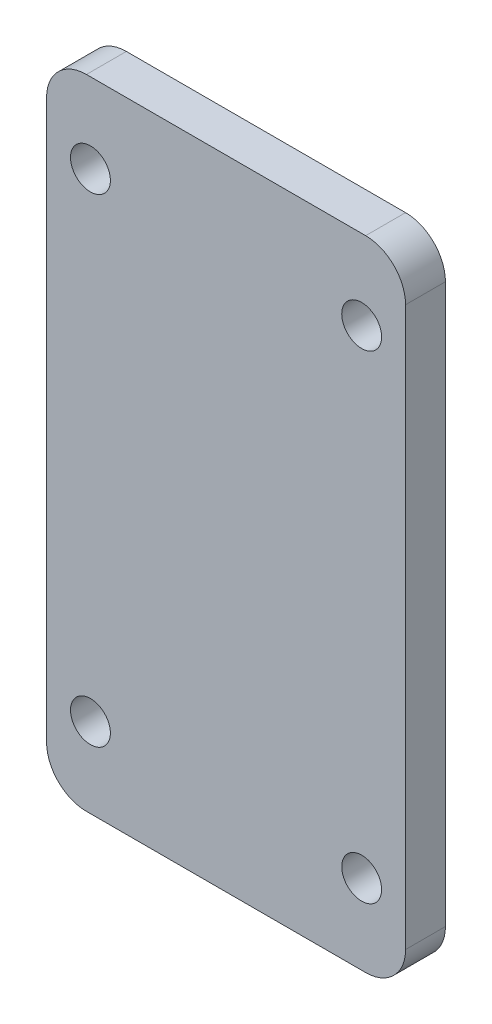
ISO-10303-21;
HEADER;
FILE_DESCRIPTION(('STEP AP214'),'2;1');
FILE_NAME('part.step','',(''),(''),'','','');
FILE_SCHEMA(('AUTOMOTIVE_DESIGN { 1 0 10303 214 1 1 1 1 }'));
ENDSEC;
DATA;
#1=APPLICATION_CONTEXT('core data for automotive mechanical design processes');
#2=APPLICATION_PROTOCOL_DEFINITION('international standard','automotive_design',2000,#1);
#3=PRODUCT_CONTEXT('',#1,'mechanical');
#4=PRODUCT('Part','Part','',(#3));
#5=PRODUCT_RELATED_PRODUCT_CATEGORY('part','',(#4));
#6=PRODUCT_DEFINITION_FORMATION('','',#4);
#7=PRODUCT_DEFINITION_CONTEXT('part definition',#1,'design');
#8=PRODUCT_DEFINITION('design','',#6,#7);
#9=PRODUCT_DEFINITION_SHAPE('','',#8);
#10=(LENGTH_UNIT() NAMED_UNIT(*) SI_UNIT(.MILLI.,.METRE.));
#11=(NAMED_UNIT(*) PLANE_ANGLE_UNIT() SI_UNIT($,.RADIAN.));
#12=(NAMED_UNIT(*) SI_UNIT($,.STERADIAN.) SOLID_ANGLE_UNIT());
#13=UNCERTAINTY_MEASURE_WITH_UNIT(LENGTH_MEASURE(1.E-05),#10,'distance_accuracy_value','');
#14=(GEOMETRIC_REPRESENTATION_CONTEXT(3) GLOBAL_UNCERTAINTY_ASSIGNED_CONTEXT((#13)) GLOBAL_UNIT_ASSIGNED_CONTEXT((#10,
#11,#12)) REPRESENTATION_CONTEXT('',''));
#15=CARTESIAN_POINT('',(0.,0.,0.));
#16=DIRECTION('',(0.,0.,1.));
#17=DIRECTION('',(1.,0.,0.));
#18=AXIS2_PLACEMENT_3D('',#15,#16,#17);
#19=CARTESIAN_POINT('',(0.,0.,5.));
#20=DIRECTION('',(0.,0.,1.));
#21=DIRECTION('',(1.,0.,0.));
#22=AXIS2_PLACEMENT_3D('',#19,#20,#21);
#23=PLANE('',#22);
#24=CARTESIAN_POINT('',(17.,-30.,5.));
#25=DIRECTION('',(0.,0.,1.));
#26=DIRECTION('',(1.,0.,0.));
#27=AXIS2_PLACEMENT_3D('',#24,#25,#26);
#28=CIRCLE('',#27,2.5);
#29=CARTESIAN_POINT('',(19.5,-30.,5.));
#30=VERTEX_POINT('',#29);
#31=EDGE_CURVE('E201',#30,#30,#28,.T.);
#32=ORIENTED_EDGE('',*,*,#31,.F.);
#33=EDGE_LOOP('',(#32));
#34=FACE_BOUND('',#33,.T.);
#35=CARTESIAN_POINT('',(-17.,30.,5.));
#36=DIRECTION('',(0.,0.,1.));
#37=DIRECTION('',(1.,0.,0.));
#38=AXIS2_PLACEMENT_3D('',#35,#36,#37);
#39=CIRCLE('',#38,2.5);
#40=CARTESIAN_POINT('',(-14.5,30.,5.));
#41=VERTEX_POINT('',#40);
#42=EDGE_CURVE('E139',#41,#41,#39,.T.);
#43=ORIENTED_EDGE('',*,*,#42,.F.);
#44=EDGE_LOOP('',(#43));
#45=FACE_BOUND('',#44,.T.);
#46=DIRECTION('',(1.,0.,0.));
#47=VECTOR('',#46,1.);
#48=CARTESIAN_POINT('',(-22.5,-40.,5.));
#49=LINE('',#48,#47);
#50=CARTESIAN_POINT('',(-17.5,-40.,5.));
#51=VERTEX_POINT('',#50);
#52=CARTESIAN_POINT('',(17.5,-40.,5.));
#53=VERTEX_POINT('',#52);
#54=EDGE_CURVE('E148',#51,#53,#49,.T.);
#55=ORIENTED_EDGE('',*,*,#54,.T.);
#56=CARTESIAN_POINT('',(17.5,-35.,5.));
#57=DIRECTION('',(0.,0.,1.));
#58=DIRECTION('',(1.,0.,0.));
#59=AXIS2_PLACEMENT_3D('',#56,#57,#58);
#60=CIRCLE('',#59,5.);
#61=CARTESIAN_POINT('',(22.5,-35.,5.));
#62=VERTEX_POINT('',#61);
#63=EDGE_CURVE('E166',#53,#62,#60,.T.);
#64=ORIENTED_EDGE('',*,*,#63,.T.);
#65=DIRECTION('',(0.,1.,0.));
#66=VECTOR('',#65,1.);
#67=CARTESIAN_POINT('',(22.5,40.,5.));
#68=LINE('',#67,#66);
#69=CARTESIAN_POINT('',(22.5,35.,5.));
#70=VERTEX_POINT('',#69);
#71=EDGE_CURVE('E130',#62,#70,#68,.T.);
#72=ORIENTED_EDGE('',*,*,#71,.T.);
#73=CARTESIAN_POINT('',(17.5,35.,5.));
#74=DIRECTION('',(0.,0.,1.));
#75=DIRECTION('',(1.,0.,0.));
#76=AXIS2_PLACEMENT_3D('',#73,#74,#75);
#77=CIRCLE('',#76,5.);
#78=CARTESIAN_POINT('',(17.5,40.,5.));
#79=VERTEX_POINT('',#78);
#80=EDGE_CURVE('E162',#70,#79,#77,.T.);
#81=ORIENTED_EDGE('',*,*,#80,.T.);
#82=DIRECTION('',(-1.,0.,0.));
#83=VECTOR('',#82,1.);
#84=CARTESIAN_POINT('',(-22.5,40.,5.));
#85=LINE('',#84,#83);
#86=CARTESIAN_POINT('',(-17.5,40.,5.));
#87=VERTEX_POINT('',#86);
#88=EDGE_CURVE('E175',#79,#87,#85,.T.);
#89=ORIENTED_EDGE('',*,*,#88,.T.);
#90=CARTESIAN_POINT('',(-17.5,35.,5.));
#91=DIRECTION('',(0.,0.,1.));
#92=DIRECTION('',(1.,0.,0.));
#93=AXIS2_PLACEMENT_3D('',#90,#91,#92);
#94=CIRCLE('',#93,5.);
#95=CARTESIAN_POINT('',(-22.5,35.,5.));
#96=VERTEX_POINT('',#95);
#97=EDGE_CURVE('E65',#87,#96,#94,.T.);
#98=ORIENTED_EDGE('',*,*,#97,.T.);
#99=DIRECTION('',(0.,-1.,0.));
#100=VECTOR('',#99,1.);
#101=CARTESIAN_POINT('',(-22.5,40.,5.));
#102=LINE('',#101,#100);
#103=CARTESIAN_POINT('',(-22.5,-35.,5.));
#104=VERTEX_POINT('',#103);
#105=EDGE_CURVE('E181',#96,#104,#102,.T.);
#106=ORIENTED_EDGE('',*,*,#105,.T.);
#107=CARTESIAN_POINT('',(-17.5,-35.,5.));
#108=DIRECTION('',(0.,0.,1.));
#109=DIRECTION('',(1.,0.,0.));
#110=AXIS2_PLACEMENT_3D('',#107,#108,#109);
#111=CIRCLE('',#110,5.);
#112=EDGE_CURVE('E164',#104,#51,#111,.T.);
#113=ORIENTED_EDGE('',*,*,#112,.T.);
#114=EDGE_LOOP('',(#55,#64,#72,#81,#89,#98,#106,#113));
#115=FACE_BOUND('',#114,.T.);
#116=CARTESIAN_POINT('',(-17.,-30.,5.));
#117=DIRECTION('',(0.,0.,1.));
#118=DIRECTION('',(-1.,0.,0.));
#119=AXIS2_PLACEMENT_3D('',#116,#117,#118);
#120=CIRCLE('',#119,2.5);
#121=CARTESIAN_POINT('',(-19.5,-30.,5.));
#122=VERTEX_POINT('',#121);
#123=EDGE_CURVE('E196',#122,#122,#120,.T.);
#124=ORIENTED_EDGE('',*,*,#123,.F.);
#125=EDGE_LOOP('',(#124));
#126=FACE_BOUND('',#125,.T.);
#127=CARTESIAN_POINT('',(17.,30.,5.));
#128=DIRECTION('',(0.,0.,1.));
#129=DIRECTION('',(-1.,0.,0.));
#130=AXIS2_PLACEMENT_3D('',#127,#128,#129);
#131=CIRCLE('',#130,2.5);
#132=CARTESIAN_POINT('',(14.5,30.,5.));
#133=VERTEX_POINT('',#132);
#134=EDGE_CURVE('E207',#133,#133,#131,.T.);
#135=ORIENTED_EDGE('',*,*,#134,.F.);
#136=EDGE_LOOP('',(#135));
#137=FACE_BOUND('',#136,.T.);
#138=ADVANCED_FACE('F43',(#34,#45,#115,#126,#137),#23,.T.);
#139=CARTESIAN_POINT('',(0.,0.,0.));
#140=DIRECTION('',(0.,0.,1.));
#141=DIRECTION('',(1.,0.,0.));
#142=AXIS2_PLACEMENT_3D('',#139,#140,#141);
#143=PLANE('',#142);
#144=DIRECTION('',(0.,1.,0.));
#145=VECTOR('',#144,1.);
#146=CARTESIAN_POINT('',(22.5,40.,0.));
#147=LINE('',#146,#145);
#148=CARTESIAN_POINT('',(22.5,-35.,0.));
#149=VERTEX_POINT('',#148);
#150=CARTESIAN_POINT('',(22.5,35.,0.));
#151=VERTEX_POINT('',#150);
#152=EDGE_CURVE('E127',#149,#151,#147,.T.);
#153=ORIENTED_EDGE('',*,*,#152,.F.);
#154=CARTESIAN_POINT('',(17.5,-35.,0.));
#155=DIRECTION('',(0.,0.,1.));
#156=DIRECTION('',(1.,0.,0.));
#157=AXIS2_PLACEMENT_3D('',#154,#155,#156);
#158=CIRCLE('',#157,5.);
#159=CARTESIAN_POINT('',(17.5,-40.,0.));
#160=VERTEX_POINT('',#159);
#161=EDGE_CURVE('E110',#149,#160,#158,.F.);
#162=ORIENTED_EDGE('',*,*,#161,.T.);
#163=DIRECTION('',(1.,0.,0.));
#164=VECTOR('',#163,1.);
#165=CARTESIAN_POINT('',(-22.5,-40.,0.));
#166=LINE('',#165,#164);
#167=CARTESIAN_POINT('',(-17.5,-40.,0.));
#168=VERTEX_POINT('',#167);
#169=EDGE_CURVE('E152',#168,#160,#166,.T.);
#170=ORIENTED_EDGE('',*,*,#169,.F.);
#171=CARTESIAN_POINT('',(-17.5,-35.,0.));
#172=DIRECTION('',(0.,0.,1.));
#173=DIRECTION('',(1.,0.,0.));
#174=AXIS2_PLACEMENT_3D('',#171,#172,#173);
#175=CIRCLE('',#174,5.);
#176=CARTESIAN_POINT('',(-22.5,-35.,0.));
#177=VERTEX_POINT('',#176);
#178=EDGE_CURVE('E121',#168,#177,#175,.F.);
#179=ORIENTED_EDGE('',*,*,#178,.T.);
#180=DIRECTION('',(0.,-1.,0.));
#181=VECTOR('',#180,1.);
#182=CARTESIAN_POINT('',(-22.5,40.,0.));
#183=LINE('',#182,#181);
#184=CARTESIAN_POINT('',(-22.5,35.,0.));
#185=VERTEX_POINT('',#184);
#186=EDGE_CURVE('E142',#185,#177,#183,.T.);
#187=ORIENTED_EDGE('',*,*,#186,.F.);
#188=CARTESIAN_POINT('',(-17.5,35.,0.));
#189=DIRECTION('',(0.,0.,1.));
#190=DIRECTION('',(1.,0.,0.));
#191=AXIS2_PLACEMENT_3D('',#188,#189,#190);
#192=CIRCLE('',#191,5.);
#193=CARTESIAN_POINT('',(-17.5,40.,0.));
#194=VERTEX_POINT('',#193);
#195=EDGE_CURVE('E131',#185,#194,#192,.F.);
#196=ORIENTED_EDGE('',*,*,#195,.T.);
#197=DIRECTION('',(-1.,0.,0.));
#198=VECTOR('',#197,1.);
#199=CARTESIAN_POINT('',(-22.5,40.,0.));
#200=LINE('',#199,#198);
#201=CARTESIAN_POINT('',(17.5,40.,0.));
#202=VERTEX_POINT('',#201);
#203=EDGE_CURVE('E138',#202,#194,#200,.T.);
#204=ORIENTED_EDGE('',*,*,#203,.F.);
#205=CARTESIAN_POINT('',(17.5,35.,0.));
#206=DIRECTION('',(0.,0.,1.));
#207=DIRECTION('',(1.,0.,0.));
#208=AXIS2_PLACEMENT_3D('',#205,#206,#207);
#209=CIRCLE('',#208,5.);
#210=EDGE_CURVE('E137',#202,#151,#209,.F.);
#211=ORIENTED_EDGE('',*,*,#210,.T.);
#212=EDGE_LOOP('',(#153,#162,#170,#179,#187,#196,#204,#211));
#213=FACE_BOUND('',#212,.T.);
#214=CARTESIAN_POINT('',(-17.,30.,0.));
#215=DIRECTION('',(0.,0.,1.));
#216=DIRECTION('',(1.,0.,0.));
#217=AXIS2_PLACEMENT_3D('',#214,#215,#216);
#218=CIRCLE('',#217,2.5);
#219=CARTESIAN_POINT('',(-14.5,30.,0.));
#220=VERTEX_POINT('',#219);
#221=EDGE_CURVE('E145',#220,#220,#218,.T.);
#222=ORIENTED_EDGE('',*,*,#221,.T.);
#223=EDGE_LOOP('',(#222));
#224=FACE_BOUND('',#223,.T.);
#225=CARTESIAN_POINT('',(-17.,-30.,0.));
#226=DIRECTION('',(0.,0.,1.));
#227=DIRECTION('',(-1.,0.,0.));
#228=AXIS2_PLACEMENT_3D('',#225,#226,#227);
#229=CIRCLE('',#228,2.5);
#230=CARTESIAN_POINT('',(-19.5,-30.,0.));
#231=VERTEX_POINT('',#230);
#232=EDGE_CURVE('E198',#231,#231,#229,.T.);
#233=ORIENTED_EDGE('',*,*,#232,.T.);
#234=EDGE_LOOP('',(#233));
#235=FACE_BOUND('',#234,.T.);
#236=CARTESIAN_POINT('',(17.,-30.,0.));
#237=DIRECTION('',(0.,0.,1.));
#238=DIRECTION('',(1.,0.,0.));
#239=AXIS2_PLACEMENT_3D('',#236,#237,#238);
#240=CIRCLE('',#239,2.5);
#241=CARTESIAN_POINT('',(19.5,-30.,0.));
#242=VERTEX_POINT('',#241);
#243=EDGE_CURVE('E204',#242,#242,#240,.T.);
#244=ORIENTED_EDGE('',*,*,#243,.T.);
#245=EDGE_LOOP('',(#244));
#246=FACE_BOUND('',#245,.T.);
#247=CARTESIAN_POINT('',(17.,30.,0.));
#248=DIRECTION('',(0.,0.,1.));
#249=DIRECTION('',(-1.,0.,0.));
#250=AXIS2_PLACEMENT_3D('',#247,#248,#249);
#251=CIRCLE('',#250,2.5);
#252=CARTESIAN_POINT('',(14.5,30.,0.));
#253=VERTEX_POINT('',#252);
#254=EDGE_CURVE('E210',#253,#253,#251,.T.);
#255=ORIENTED_EDGE('',*,*,#254,.T.);
#256=EDGE_LOOP('',(#255));
#257=FACE_BOUND('',#256,.T.);
#258=ADVANCED_FACE('F134',(#213,#224,#235,#246,#257),#143,.F.);
#259=CARTESIAN_POINT('',(22.5,40.,5.));
#260=DIRECTION('',(-1.,0.,0.));
#261=DIRECTION('',(0.,0.,1.));
#262=AXIS2_PLACEMENT_3D('',#259,#260,#261);
#263=PLANE('',#262);
#264=ORIENTED_EDGE('',*,*,#71,.F.);
#265=DIRECTION('',(0.,0.,-1.));
#266=VECTOR('',#265,1.);
#267=CARTESIAN_POINT('',(22.5,-35.,5.));
#268=LINE('',#267,#266);
#269=EDGE_CURVE('E114',#62,#149,#268,.T.);
#270=ORIENTED_EDGE('',*,*,#269,.T.);
#271=ORIENTED_EDGE('',*,*,#152,.T.);
#272=DIRECTION('',(0.,0.,-1.));
#273=VECTOR('',#272,1.);
#274=CARTESIAN_POINT('',(22.5,35.,5.));
#275=LINE('',#274,#273);
#276=EDGE_CURVE('E132',#151,#70,#275,.F.);
#277=ORIENTED_EDGE('',*,*,#276,.T.);
#278=EDGE_LOOP('',(#264,#270,#271,#277));
#279=FACE_BOUND('',#278,.T.);
#280=ADVANCED_FACE('F126',(#279),#263,.F.);
#281=CARTESIAN_POINT('',(-22.5,40.,5.));
#282=DIRECTION('',(0.,-1.,0.));
#283=DIRECTION('',(0.,0.,-1.));
#284=AXIS2_PLACEMENT_3D('',#281,#282,#283);
#285=PLANE('',#284);
#286=ORIENTED_EDGE('',*,*,#88,.F.);
#287=DIRECTION('',(0.,0.,-1.));
#288=VECTOR('',#287,1.);
#289=CARTESIAN_POINT('',(17.5,40.,5.));
#290=LINE('',#289,#288);
#291=EDGE_CURVE('E11',#79,#202,#290,.T.);
#292=ORIENTED_EDGE('',*,*,#291,.T.);
#293=ORIENTED_EDGE('',*,*,#203,.T.);
#294=DIRECTION('',(0.,0.,-1.));
#295=VECTOR('',#294,1.);
#296=CARTESIAN_POINT('',(-17.5,40.,5.));
#297=LINE('',#296,#295);
#298=EDGE_CURVE('E51',#194,#87,#297,.F.);
#299=ORIENTED_EDGE('',*,*,#298,.T.);
#300=EDGE_LOOP('',(#286,#292,#293,#299));
#301=FACE_BOUND('',#300,.T.);
#302=ADVANCED_FACE('F174',(#301),#285,.F.);
#303=CARTESIAN_POINT('',(-22.5,40.,5.));
#304=DIRECTION('',(1.,0.,0.));
#305=DIRECTION('',(0.,0.,-1.));
#306=AXIS2_PLACEMENT_3D('',#303,#304,#305);
#307=PLANE('',#306);
#308=ORIENTED_EDGE('',*,*,#186,.T.);
#309=DIRECTION('',(0.,0.,-1.));
#310=VECTOR('',#309,1.);
#311=CARTESIAN_POINT('',(-22.5,-35.,5.));
#312=LINE('',#311,#310);
#313=EDGE_CURVE('E58',#177,#104,#312,.F.);
#314=ORIENTED_EDGE('',*,*,#313,.T.);
#315=ORIENTED_EDGE('',*,*,#105,.F.);
#316=DIRECTION('',(0.,0.,-1.));
#317=VECTOR('',#316,1.);
#318=CARTESIAN_POINT('',(-22.5,35.,5.));
#319=LINE('',#318,#317);
#320=EDGE_CURVE('E168',#96,#185,#319,.T.);
#321=ORIENTED_EDGE('',*,*,#320,.T.);
#322=EDGE_LOOP('',(#308,#314,#315,#321));
#323=FACE_BOUND('',#322,.T.);
#324=ADVANCED_FACE('F185',(#323),#307,.F.);
#325=CARTESIAN_POINT('',(-22.5,-40.,5.));
#326=DIRECTION('',(0.,1.,0.));
#327=DIRECTION('',(0.,0.,1.));
#328=AXIS2_PLACEMENT_3D('',#325,#326,#327);
#329=PLANE('',#328);
#330=ORIENTED_EDGE('',*,*,#169,.T.);
#331=DIRECTION('',(0.,0.,-1.));
#332=VECTOR('',#331,1.);
#333=CARTESIAN_POINT('',(17.5,-40.,5.));
#334=LINE('',#333,#332);
#335=EDGE_CURVE('E115',#160,#53,#334,.F.);
#336=ORIENTED_EDGE('',*,*,#335,.T.);
#337=ORIENTED_EDGE('',*,*,#54,.F.);
#338=DIRECTION('',(0.,0.,-1.));
#339=VECTOR('',#338,1.);
#340=CARTESIAN_POINT('',(-17.5,-40.,5.));
#341=LINE('',#340,#339);
#342=EDGE_CURVE('E120',#51,#168,#341,.T.);
#343=ORIENTED_EDGE('',*,*,#342,.T.);
#344=EDGE_LOOP('',(#330,#336,#337,#343));
#345=FACE_BOUND('',#344,.T.);
#346=ADVANCED_FACE('F192',(#345),#329,.F.);
#347=CARTESIAN_POINT('',(-17.,30.,5.));
#348=DIRECTION('',(0.,0.,-1.));
#349=DIRECTION('',(-1.,0.,0.));
#350=AXIS2_PLACEMENT_3D('',#347,#348,#349);
#351=CYLINDRICAL_SURFACE('',#350,2.5);
#352=ORIENTED_EDGE('',*,*,#42,.T.);
#353=EDGE_LOOP('',(#352));
#354=FACE_BOUND('',#353,.T.);
#355=ORIENTED_EDGE('',*,*,#221,.F.);
#356=EDGE_LOOP('',(#355));
#357=FACE_BOUND('',#356,.T.);
#358=ADVANCED_FACE('F230',(#354,#357),#351,.F.);
#359=CARTESIAN_POINT('',(-17.,-30.,5.));
#360=DIRECTION('',(0.,0.,-1.));
#361=DIRECTION('',(-1.,0.,0.));
#362=AXIS2_PLACEMENT_3D('',#359,#360,#361);
#363=CYLINDRICAL_SURFACE('',#362,2.5);
#364=ORIENTED_EDGE('',*,*,#123,.T.);
#365=EDGE_LOOP('',(#364));
#366=FACE_BOUND('',#365,.T.);
#367=ORIENTED_EDGE('',*,*,#232,.F.);
#368=EDGE_LOOP('',(#367));
#369=FACE_BOUND('',#368,.T.);
#370=ADVANCED_FACE('F314',(#366,#369),#363,.F.);
#371=CARTESIAN_POINT('',(17.,-30.,5.));
#372=DIRECTION('',(0.,0.,-1.));
#373=DIRECTION('',(-1.,0.,0.));
#374=AXIS2_PLACEMENT_3D('',#371,#372,#373);
#375=CYLINDRICAL_SURFACE('',#374,2.5);
#376=ORIENTED_EDGE('',*,*,#31,.T.);
#377=EDGE_LOOP('',(#376));
#378=FACE_BOUND('',#377,.T.);
#379=ORIENTED_EDGE('',*,*,#243,.F.);
#380=EDGE_LOOP('',(#379));
#381=FACE_BOUND('',#380,.T.);
#382=ADVANCED_FACE('F322',(#378,#381),#375,.F.);
#383=CARTESIAN_POINT('',(17.,30.,5.));
#384=DIRECTION('',(0.,0.,-1.));
#385=DIRECTION('',(-1.,0.,0.));
#386=AXIS2_PLACEMENT_3D('',#383,#384,#385);
#387=CYLINDRICAL_SURFACE('',#386,2.5);
#388=ORIENTED_EDGE('',*,*,#134,.T.);
#389=EDGE_LOOP('',(#388));
#390=FACE_BOUND('',#389,.T.);
#391=ORIENTED_EDGE('',*,*,#254,.F.);
#392=EDGE_LOOP('',(#391));
#393=FACE_BOUND('',#392,.T.);
#394=ADVANCED_FACE('F216',(#390,#393),#387,.F.);
#395=CARTESIAN_POINT('',(17.5,-35.,5.));
#396=DIRECTION('',(0.,0.,-1.));
#397=DIRECTION('',(-1.,0.,0.));
#398=AXIS2_PLACEMENT_3D('',#395,#396,#397);
#399=CYLINDRICAL_SURFACE('',#398,5.);
#400=ORIENTED_EDGE('',*,*,#63,.F.);
#401=ORIENTED_EDGE('',*,*,#335,.F.);
#402=ORIENTED_EDGE('',*,*,#161,.F.);
#403=ORIENTED_EDGE('',*,*,#269,.F.);
#404=EDGE_LOOP('',(#400,#401,#402,#403));
#405=FACE_BOUND('',#404,.T.);
#406=ADVANCED_FACE('F113',(#405),#399,.T.);
#407=CARTESIAN_POINT('',(-17.5,-35.,5.));
#408=DIRECTION('',(0.,0.,-1.));
#409=DIRECTION('',(-1.,0.,0.));
#410=AXIS2_PLACEMENT_3D('',#407,#408,#409);
#411=CYLINDRICAL_SURFACE('',#410,5.);
#412=ORIENTED_EDGE('',*,*,#112,.F.);
#413=ORIENTED_EDGE('',*,*,#313,.F.);
#414=ORIENTED_EDGE('',*,*,#178,.F.);
#415=ORIENTED_EDGE('',*,*,#342,.F.);
#416=EDGE_LOOP('',(#412,#413,#414,#415));
#417=FACE_BOUND('',#416,.T.);
#418=ADVANCED_FACE('F189',(#417),#411,.T.);
#419=CARTESIAN_POINT('',(17.5,35.,5.));
#420=DIRECTION('',(0.,0.,-1.));
#421=DIRECTION('',(-1.,0.,0.));
#422=AXIS2_PLACEMENT_3D('',#419,#420,#421);
#423=CYLINDRICAL_SURFACE('',#422,5.);
#424=ORIENTED_EDGE('',*,*,#80,.F.);
#425=ORIENTED_EDGE('',*,*,#276,.F.);
#426=ORIENTED_EDGE('',*,*,#210,.F.);
#427=ORIENTED_EDGE('',*,*,#291,.F.);
#428=EDGE_LOOP('',(#424,#425,#426,#427));
#429=FACE_BOUND('',#428,.T.);
#430=ADVANCED_FACE('F244',(#429),#423,.T.);
#431=CARTESIAN_POINT('',(-17.5,35.,5.));
#432=DIRECTION('',(0.,0.,-1.));
#433=DIRECTION('',(-1.,0.,0.));
#434=AXIS2_PLACEMENT_3D('',#431,#432,#433);
#435=CYLINDRICAL_SURFACE('',#434,5.);
#436=ORIENTED_EDGE('',*,*,#97,.F.);
#437=ORIENTED_EDGE('',*,*,#298,.F.);
#438=ORIENTED_EDGE('',*,*,#195,.F.);
#439=ORIENTED_EDGE('',*,*,#320,.F.);
#440=EDGE_LOOP('',(#436,#437,#438,#439));
#441=FACE_BOUND('',#440,.T.);
#442=ADVANCED_FACE('F45',(#441),#435,.T.);
#443=CLOSED_SHELL('',(#138,#258,#280,#302,#324,#346,#358,#370,#382,#394,#406,#418,#430,#442));
#444=MANIFOLD_SOLID_BREP('B2',#443);
#445=ADVANCED_BREP_SHAPE_REPRESENTATION('',(#18,#444),#14);
#446=SHAPE_DEFINITION_REPRESENTATION(#9,#445);
ENDSEC;
END-ISO-10303-21;
